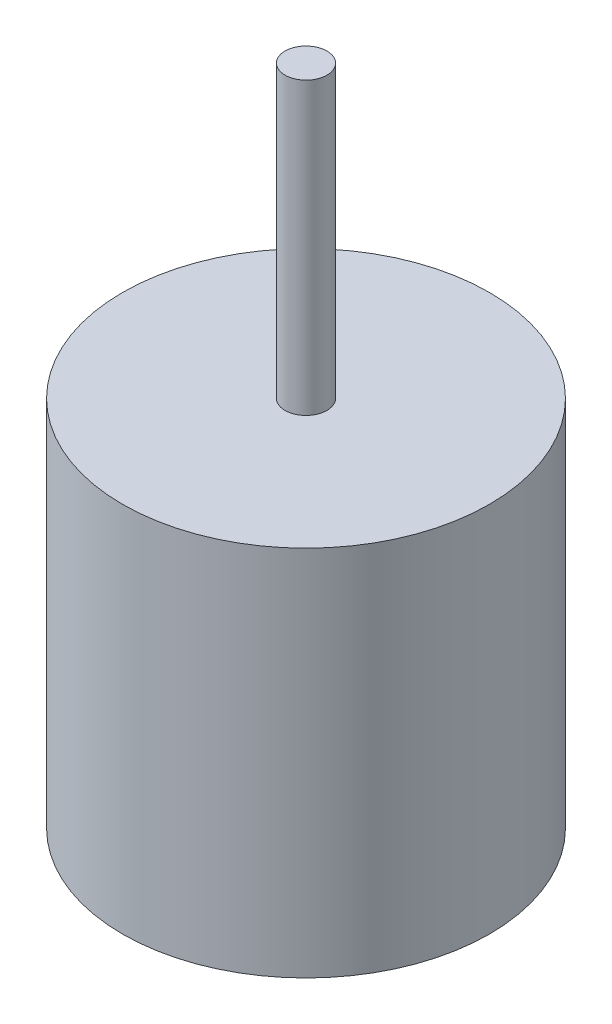
ISO-10303-21;
HEADER;
FILE_DESCRIPTION(('STEP AP214'),'2;1');
FILE_NAME('part.step','',(''),(''),'','','');
FILE_SCHEMA(('AUTOMOTIVE_DESIGN { 1 0 10303 214 1 1 1 1 }'));
ENDSEC;
DATA;
#1=APPLICATION_CONTEXT('core data for automotive mechanical design processes');
#2=APPLICATION_PROTOCOL_DEFINITION('international standard','automotive_design',2000,#1);
#3=PRODUCT_CONTEXT('',#1,'mechanical');
#4=PRODUCT('Part','Part','',(#3));
#5=PRODUCT_RELATED_PRODUCT_CATEGORY('part','',(#4));
#6=PRODUCT_DEFINITION_FORMATION('','',#4);
#7=PRODUCT_DEFINITION_CONTEXT('part definition',#1,'design');
#8=PRODUCT_DEFINITION('design','',#6,#7);
#9=PRODUCT_DEFINITION_SHAPE('','',#8);
#10=(LENGTH_UNIT() NAMED_UNIT(*) SI_UNIT(.MILLI.,.METRE.));
#11=(NAMED_UNIT(*) PLANE_ANGLE_UNIT() SI_UNIT($,.RADIAN.));
#12=(NAMED_UNIT(*) SI_UNIT($,.STERADIAN.) SOLID_ANGLE_UNIT());
#13=UNCERTAINTY_MEASURE_WITH_UNIT(LENGTH_MEASURE(1.E-05),#10,'distance_accuracy_value','');
#14=(GEOMETRIC_REPRESENTATION_CONTEXT(3) GLOBAL_UNCERTAINTY_ASSIGNED_CONTEXT((#13)) GLOBAL_UNIT_ASSIGNED_CONTEXT((#10,
#11,#12)) REPRESENTATION_CONTEXT('',''));
#15=CARTESIAN_POINT('',(0.,0.,0.));
#16=DIRECTION('',(0.,0.,1.));
#17=DIRECTION('',(1.,0.,0.));
#18=AXIS2_PLACEMENT_3D('',#15,#16,#17);
#19=CARTESIAN_POINT('',(0.,28.2,0.));
#20=DIRECTION('',(0.,-1.,0.));
#21=DIRECTION('',(0.,0.,-1.));
#22=AXIS2_PLACEMENT_3D('',#19,#20,#21);
#23=CYLINDRICAL_SURFACE('',#22,13.9);
#24=CARTESIAN_POINT('',(0.,28.2,0.));
#25=DIRECTION('',(0.,1.,0.));
#26=DIRECTION('',(0.,0.,1.));
#27=AXIS2_PLACEMENT_3D('',#24,#25,#26);
#28=CIRCLE('',#27,13.9);
#29=CARTESIAN_POINT('',(0.,28.2,13.9));
#30=VERTEX_POINT('',#29);
#31=EDGE_CURVE('E54',#30,#30,#28,.T.);
#32=ORIENTED_EDGE('',*,*,#31,.F.);
#33=EDGE_LOOP('',(#32));
#34=FACE_BOUND('',#33,.T.);
#35=CARTESIAN_POINT('',(0.,0.,0.));
#36=DIRECTION('',(0.,1.,0.));
#37=DIRECTION('',(0.,0.,1.));
#38=AXIS2_PLACEMENT_3D('',#35,#36,#37);
#39=CIRCLE('',#38,13.9);
#40=CARTESIAN_POINT('',(0.,0.,13.9));
#41=VERTEX_POINT('',#40);
#42=EDGE_CURVE('E50',#41,#41,#39,.T.);
#43=ORIENTED_EDGE('',*,*,#42,.T.);
#44=EDGE_LOOP('',(#43));
#45=FACE_BOUND('',#44,.T.);
#46=ADVANCED_FACE('F47',(#34,#45),#23,.T.);
#47=CARTESIAN_POINT('',(0.,28.2,0.));
#48=DIRECTION('',(0.,1.,0.));
#49=DIRECTION('',(0.,0.,1.));
#50=AXIS2_PLACEMENT_3D('',#47,#48,#49);
#51=PLANE('',#50);
#52=CARTESIAN_POINT('',(0.,28.2,0.));
#53=DIRECTION('',(0.,1.,0.));
#54=DIRECTION('',(0.,0.,1.));
#55=AXIS2_PLACEMENT_3D('',#52,#53,#54);
#56=CIRCLE('',#55,1.585);
#57=CARTESIAN_POINT('',(0.,28.2,1.585));
#58=VERTEX_POINT('',#57);
#59=EDGE_CURVE('E65',#58,#58,#56,.T.);
#60=ORIENTED_EDGE('',*,*,#59,.F.);
#61=EDGE_LOOP('',(#60));
#62=FACE_BOUND('',#61,.T.);
#63=ORIENTED_EDGE('',*,*,#31,.T.);
#64=EDGE_LOOP('',(#63));
#65=FACE_BOUND('',#64,.T.);
#66=ADVANCED_FACE('F88',(#62,#65),#51,.T.);
#67=CARTESIAN_POINT('',(0.,0.,0.));
#68=DIRECTION('',(0.,1.,0.));
#69=DIRECTION('',(0.,0.,1.));
#70=AXIS2_PLACEMENT_3D('',#67,#68,#69);
#71=PLANE('',#70);
#72=CARTESIAN_POINT('',(0.,0.,0.));
#73=DIRECTION('',(0.,-1.,0.));
#74=DIRECTION('',(0.,0.,-1.));
#75=AXIS2_PLACEMENT_3D('',#72,#73,#74);
#76=CIRCLE('',#75,4.5);
#77=CARTESIAN_POINT('',(0.,0.,-4.5));
#78=VERTEX_POINT('',#77);
#79=EDGE_CURVE('E10',#78,#78,#76,.T.);
#80=ORIENTED_EDGE('',*,*,#79,.F.);
#81=EDGE_LOOP('',(#80));
#82=FACE_BOUND('',#81,.T.);
#83=ORIENTED_EDGE('',*,*,#42,.F.);
#84=EDGE_LOOP('',(#83));
#85=FACE_BOUND('',#84,.T.);
#86=ADVANCED_FACE('F93',(#82,#85),#71,.F.);
#87=CARTESIAN_POINT('',(0.,50.2,0.));
#88=DIRECTION('',(0.,-1.,0.));
#89=DIRECTION('',(0.,0.,-1.));
#90=AXIS2_PLACEMENT_3D('',#87,#88,#89);
#91=CYLINDRICAL_SURFACE('',#90,1.585);
#92=CARTESIAN_POINT('',(0.,50.2,0.));
#93=DIRECTION('',(0.,1.,0.));
#94=DIRECTION('',(0.,0.,1.));
#95=AXIS2_PLACEMENT_3D('',#92,#93,#94);
#96=CIRCLE('',#95,1.585);
#97=CARTESIAN_POINT('',(0.,50.2,1.585));
#98=VERTEX_POINT('',#97);
#99=EDGE_CURVE('E62',#98,#98,#96,.T.);
#100=ORIENTED_EDGE('',*,*,#99,.F.);
#101=EDGE_LOOP('',(#100));
#102=FACE_BOUND('',#101,.T.);
#103=ORIENTED_EDGE('',*,*,#59,.T.);
#104=EDGE_LOOP('',(#103));
#105=FACE_BOUND('',#104,.T.);
#106=ADVANCED_FACE('F84',(#102,#105),#91,.T.);
#107=CARTESIAN_POINT('',(0.,50.2,0.));
#108=DIRECTION('',(0.,1.,0.));
#109=DIRECTION('',(0.,0.,1.));
#110=AXIS2_PLACEMENT_3D('',#107,#108,#109);
#111=PLANE('',#110);
#112=ORIENTED_EDGE('',*,*,#99,.T.);
#113=EDGE_LOOP('',(#112));
#114=FACE_BOUND('',#113,.T.);
#115=ADVANCED_FACE('F76',(#114),#111,.T.);
#116=CARTESIAN_POINT('',(0.,-5.,0.));
#117=DIRECTION('',(0.,1.,0.));
#118=DIRECTION('',(0.,0.,1.));
#119=AXIS2_PLACEMENT_3D('',#116,#117,#118);
#120=CYLINDRICAL_SURFACE('',#119,4.5);
#121=CARTESIAN_POINT('',(0.,-5.,0.));
#122=DIRECTION('',(0.,-1.,0.));
#123=DIRECTION('',(0.,0.,-1.));
#124=AXIS2_PLACEMENT_3D('',#121,#122,#123);
#125=CIRCLE('',#124,4.5);
#126=CARTESIAN_POINT('',(0.,-5.,-4.5));
#127=VERTEX_POINT('',#126);
#128=EDGE_CURVE('E61',#127,#127,#125,.T.);
#129=ORIENTED_EDGE('',*,*,#128,.F.);
#130=EDGE_LOOP('',(#129));
#131=FACE_BOUND('',#130,.T.);
#132=ORIENTED_EDGE('',*,*,#79,.T.);
#133=EDGE_LOOP('',(#132));
#134=FACE_BOUND('',#133,.T.);
#135=ADVANCED_FACE('F74',(#131,#134),#120,.T.);
#136=CARTESIAN_POINT('',(0.,-5.,0.));
#137=DIRECTION('',(0.,-1.,0.));
#138=DIRECTION('',(0.,0.,-1.));
#139=AXIS2_PLACEMENT_3D('',#136,#137,#138);
#140=PLANE('',#139);
#141=ORIENTED_EDGE('',*,*,#128,.T.);
#142=EDGE_LOOP('',(#141));
#143=FACE_BOUND('',#142,.T.);
#144=ADVANCED_FACE('F72',(#143),#140,.T.);
#145=CLOSED_SHELL('',(#46,#66,#86,#106,#115,#135,#144));
#146=MANIFOLD_SOLID_BREP('B2',#145);
#147=ADVANCED_BREP_SHAPE_REPRESENTATION('',(#18,#146),#14);
#148=SHAPE_DEFINITION_REPRESENTATION(#9,#147);
ENDSEC;
END-ISO-10303-21;
